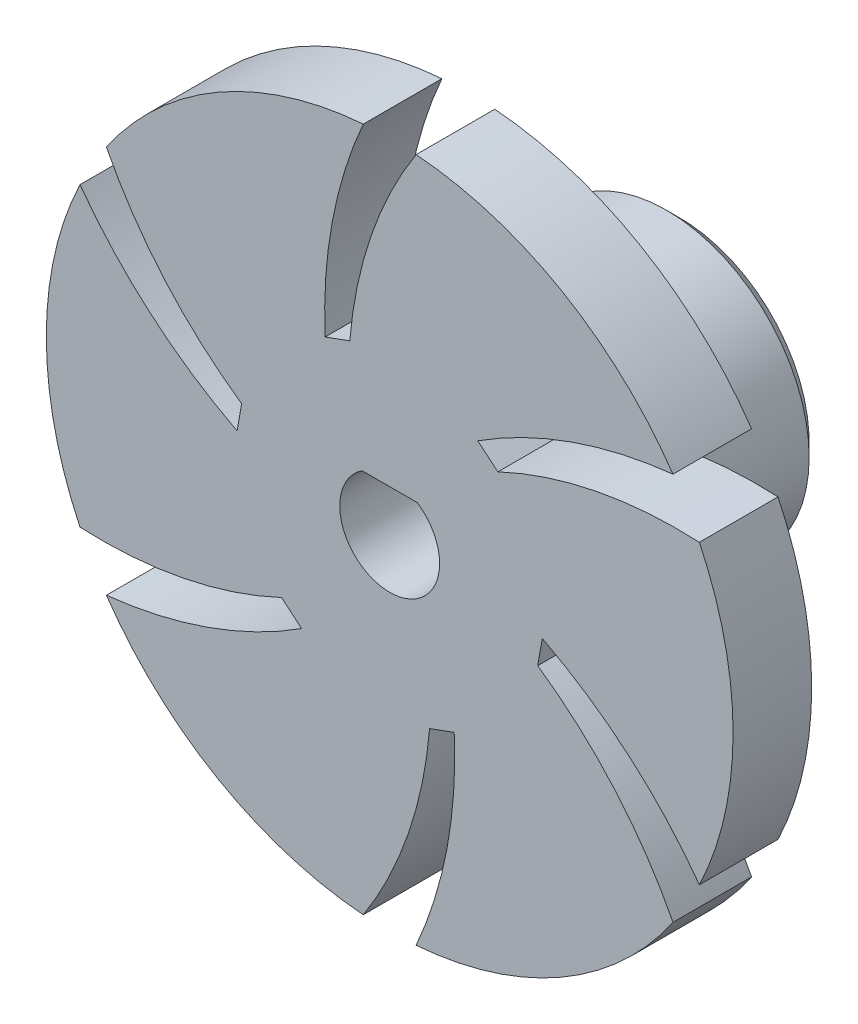
ISO-10303-21;
HEADER;
FILE_DESCRIPTION(('STEP AP214'),'2;1');
FILE_NAME('part.step','',(''),(''),'','','');
FILE_SCHEMA(('AUTOMOTIVE_DESIGN { 1 0 10303 214 1 1 1 1 }'));
ENDSEC;
DATA;
#1=APPLICATION_CONTEXT('core data for automotive mechanical design processes');
#2=APPLICATION_PROTOCOL_DEFINITION('international standard','automotive_design',2000,#1);
#3=PRODUCT_CONTEXT('',#1,'mechanical');
#4=PRODUCT('Part','Part','',(#3));
#5=PRODUCT_RELATED_PRODUCT_CATEGORY('part','',(#4));
#6=PRODUCT_DEFINITION_FORMATION('','',#4);
#7=PRODUCT_DEFINITION_CONTEXT('part definition',#1,'design');
#8=PRODUCT_DEFINITION('design','',#6,#7);
#9=PRODUCT_DEFINITION_SHAPE('','',#8);
#10=(LENGTH_UNIT() NAMED_UNIT(*) SI_UNIT(.MILLI.,.METRE.));
#11=(NAMED_UNIT(*) PLANE_ANGLE_UNIT() SI_UNIT($,.RADIAN.));
#12=(NAMED_UNIT(*) SI_UNIT($,.STERADIAN.) SOLID_ANGLE_UNIT());
#13=UNCERTAINTY_MEASURE_WITH_UNIT(LENGTH_MEASURE(1.E-05),#10,'distance_accuracy_value','');
#14=(GEOMETRIC_REPRESENTATION_CONTEXT(3) GLOBAL_UNCERTAINTY_ASSIGNED_CONTEXT((#13)) GLOBAL_UNIT_ASSIGNED_CONTEXT((#10,
#11,#12)) REPRESENTATION_CONTEXT('',''));
#15=CARTESIAN_POINT('',(0.,0.,0.));
#16=DIRECTION('',(0.,0.,1.));
#17=DIRECTION('',(1.,0.,0.));
#18=AXIS2_PLACEMENT_3D('',#15,#16,#17);
#19=CARTESIAN_POINT('',(0.,0.,2.3622));
#20=DIRECTION('',(0.,0.,-1.));
#21=DIRECTION('',(-1.,0.,0.));
#22=AXIS2_PLACEMENT_3D('',#19,#20,#21);
#23=CYLINDRICAL_SURFACE('',#22,20.6375);
#24=CARTESIAN_POINT('',(0.,0.,2.3622));
#25=DIRECTION('',(0.,0.,1.));
#26=DIRECTION('',(1.,0.,0.));
#27=AXIS2_PLACEMENT_3D('',#24,#25,#26);
#28=CIRCLE('',#27,20.6375);
#29=CARTESIAN_POINT('',(-17.0258933045108,-11.6629911872304,2.3622));
#30=VERTEX_POINT('',#29);
#31=CARTESIAN_POINT('',(-1.5875,-20.576351717445,2.3622));
#32=VERTEX_POINT('',#31);
#33=EDGE_CURVE('E487',#30,#32,#28,.T.);
#34=ORIENTED_EDGE('',*,*,#33,.F.);
#35=DIRECTION('',(0.,0.,1.));
#36=VECTOR('',#35,1.);
#37=CARTESIAN_POINT('',(-17.0258933045108,-11.6629911872304,-2.3622));
#38=LINE('',#37,#36);
#39=CARTESIAN_POINT('',(-17.0258933045108,-11.6629911872304,-2.3622));
#40=VERTEX_POINT('',#39);
#41=EDGE_CURVE('E250',#40,#30,#38,.T.);
#42=ORIENTED_EDGE('',*,*,#41,.F.);
#43=CARTESIAN_POINT('',(0.,0.,-2.3622));
#44=DIRECTION('',(0.,0.,1.));
#45=DIRECTION('',(1.,0.,0.));
#46=AXIS2_PLACEMENT_3D('',#43,#44,#45);
#47=CIRCLE('',#46,20.6375);
#48=CARTESIAN_POINT('',(-1.5875,-20.576351717445,-2.3622));
#49=VERTEX_POINT('',#48);
#50=EDGE_CURVE('E470',#40,#49,#47,.T.);
#51=ORIENTED_EDGE('',*,*,#50,.T.);
#52=DIRECTION('',(0.,0.,1.));
#53=VECTOR('',#52,1.);
#54=CARTESIAN_POINT('',(-1.5875,-20.576351717445,-2.3622));
#55=LINE('',#54,#53);
#56=EDGE_CURVE('E266',#49,#32,#55,.T.);
#57=ORIENTED_EDGE('',*,*,#56,.T.);
#58=EDGE_LOOP('',(#34,#42,#51,#57));
#59=FACE_BOUND('',#58,.T.);
#60=ADVANCED_FACE('F35',(#59),#23,.T.);
#61=CARTESIAN_POINT('',(1.5875,-20.576351717445,2.3622));
#62=VERTEX_POINT('',#61);
#63=CARTESIAN_POINT('',(17.025893304511,-11.6629911872301,2.3622));
#64=VERTEX_POINT('',#63);
#65=EDGE_CURVE('E488',#62,#64,#28,.T.);
#66=ORIENTED_EDGE('',*,*,#65,.F.);
#67=DIRECTION('',(0.,0.,1.));
#68=VECTOR('',#67,1.);
#69=CARTESIAN_POINT('',(1.5875,-20.576351717445,-2.3622));
#70=LINE('',#69,#68);
#71=CARTESIAN_POINT('',(1.5875,-20.576351717445,-2.3622));
#72=VERTEX_POINT('',#71);
#73=EDGE_CURVE('E228',#72,#62,#70,.T.);
#74=ORIENTED_EDGE('',*,*,#73,.F.);
#75=CARTESIAN_POINT('',(17.025893304511,-11.6629911872301,-2.3622));
#76=VERTEX_POINT('',#75);
#77=EDGE_CURVE('E465',#72,#76,#47,.T.);
#78=ORIENTED_EDGE('',*,*,#77,.T.);
#79=DIRECTION('',(0.,0.,1.));
#80=VECTOR('',#79,1.);
#81=CARTESIAN_POINT('',(17.025893304511,-11.6629911872301,-2.3622));
#82=LINE('',#81,#80);
#83=EDGE_CURVE('E292',#76,#64,#82,.T.);
#84=ORIENTED_EDGE('',*,*,#83,.T.);
#85=EDGE_LOOP('',(#66,#74,#78,#84));
#86=FACE_BOUND('',#85,.T.);
#87=ADVANCED_FACE('F405',(#86),#23,.T.);
#88=CARTESIAN_POINT('',(18.613393304511,-8.91336053021451,2.3622));
#89=VERTEX_POINT('',#88);
#90=CARTESIAN_POINT('',(18.6133933045108,8.9133605302149,2.3622));
#91=VERTEX_POINT('',#90);
#92=EDGE_CURVE('E491',#89,#91,#28,.T.);
#93=ORIENTED_EDGE('',*,*,#92,.F.);
#94=DIRECTION('',(0.,0.,1.));
#95=VECTOR('',#94,1.);
#96=CARTESIAN_POINT('',(18.613393304511,-8.91336053021451,-2.3622));
#97=LINE('',#96,#95);
#98=CARTESIAN_POINT('',(18.613393304511,-8.91336053021451,-2.3622));
#99=VERTEX_POINT('',#98);
#100=EDGE_CURVE('E256',#99,#89,#97,.T.);
#101=ORIENTED_EDGE('',*,*,#100,.F.);
#102=CARTESIAN_POINT('',(18.6133933045108,8.9133605302149,-2.3622));
#103=VERTEX_POINT('',#102);
#104=EDGE_CURVE('E463',#99,#103,#47,.T.);
#105=ORIENTED_EDGE('',*,*,#104,.T.);
#106=DIRECTION('',(0.,0.,1.));
#107=VECTOR('',#106,1.);
#108=CARTESIAN_POINT('',(18.6133933045108,8.9133605302149,-2.3622));
#109=LINE('',#108,#107);
#110=EDGE_CURVE('E316',#103,#91,#109,.T.);
#111=ORIENTED_EDGE('',*,*,#110,.T.);
#112=EDGE_LOOP('',(#93,#101,#105,#111));
#113=FACE_BOUND('',#112,.T.);
#114=ADVANCED_FACE('F411',(#113),#23,.T.);
#115=CARTESIAN_POINT('',(17.0258933045108,11.6629911872305,2.3622));
#116=VERTEX_POINT('',#115);
#117=CARTESIAN_POINT('',(1.5875,20.576351717445,2.3622));
#118=VERTEX_POINT('',#117);
#119=EDGE_CURVE('E387',#116,#118,#28,.T.);
#120=ORIENTED_EDGE('',*,*,#119,.F.);
#121=DIRECTION('',(0.,0.,1.));
#122=VECTOR('',#121,1.);
#123=CARTESIAN_POINT('',(17.0258933045108,11.6629911872305,-2.3622));
#124=LINE('',#123,#122);
#125=CARTESIAN_POINT('',(17.0258933045108,11.6629911872305,-2.3622));
#126=VERTEX_POINT('',#125);
#127=EDGE_CURVE('E282',#126,#116,#124,.T.);
#128=ORIENTED_EDGE('',*,*,#127,.F.);
#129=CARTESIAN_POINT('',(1.5875,20.576351717445,-2.3622));
#130=VERTEX_POINT('',#129);
#131=EDGE_CURVE('E375',#126,#130,#47,.T.);
#132=ORIENTED_EDGE('',*,*,#131,.T.);
#133=DIRECTION('',(0.,0.,1.));
#134=VECTOR('',#133,1.);
#135=CARTESIAN_POINT('',(1.5875,20.576351717445,-2.3622));
#136=LINE('',#135,#134);
#137=EDGE_CURVE('E376',#130,#118,#136,.T.);
#138=ORIENTED_EDGE('',*,*,#137,.T.);
#139=EDGE_LOOP('',(#120,#128,#132,#138));
#140=FACE_BOUND('',#139,.T.);
#141=ADVANCED_FACE('F426',(#140),#23,.T.);
#142=CARTESIAN_POINT('',(-18.6133933045109,8.91336053021464,-2.3622));
#143=VERTEX_POINT('',#142);
#144=CARTESIAN_POINT('',(-18.6133933045109,-8.91336053021477,-2.3622));
#145=VERTEX_POINT('',#144);
#146=EDGE_CURVE('E391',#143,#145,#47,.T.);
#147=ORIENTED_EDGE('',*,*,#146,.T.);
#148=DIRECTION('',(0.,0.,1.));
#149=VECTOR('',#148,1.);
#150=CARTESIAN_POINT('',(-18.6133933045109,-8.91336053021477,-2.3622));
#151=LINE('',#150,#149);
#152=CARTESIAN_POINT('',(-18.6133933045109,-8.91336053021477,2.3622));
#153=VERTEX_POINT('',#152);
#154=EDGE_CURVE('E238',#145,#153,#151,.T.);
#155=ORIENTED_EDGE('',*,*,#154,.T.);
#156=CARTESIAN_POINT('',(-18.6133933045109,8.91336053021464,2.3622));
#157=VERTEX_POINT('',#156);
#158=EDGE_CURVE('E386',#157,#153,#28,.T.);
#159=ORIENTED_EDGE('',*,*,#158,.F.);
#160=DIRECTION('',(0.,0.,1.));
#161=VECTOR('',#160,1.);
#162=CARTESIAN_POINT('',(-18.6133933045109,8.91336053021464,-2.3622));
#163=LINE('',#162,#161);
#164=EDGE_CURVE('E352',#143,#157,#163,.T.);
#165=ORIENTED_EDGE('',*,*,#164,.F.);
#166=EDGE_LOOP('',(#147,#155,#159,#165));
#167=FACE_BOUND('',#166,.T.);
#168=ADVANCED_FACE('F417',(#167),#23,.T.);
#169=CARTESIAN_POINT('',(-1.5875,20.576351717445,-2.3622));
#170=VERTEX_POINT('',#169);
#171=CARTESIAN_POINT('',(-17.0258933045109,11.6629911872302,-2.3622));
#172=VERTEX_POINT('',#171);
#173=EDGE_CURVE('E388',#170,#172,#47,.T.);
#174=ORIENTED_EDGE('',*,*,#173,.T.);
#175=DIRECTION('',(0.,0.,1.));
#176=VECTOR('',#175,1.);
#177=CARTESIAN_POINT('',(-17.0258933045109,11.6629911872302,-2.3622));
#178=LINE('',#177,#176);
#179=CARTESIAN_POINT('',(-17.0258933045109,11.6629911872302,2.3622));
#180=VERTEX_POINT('',#179);
#181=EDGE_CURVE('E340',#172,#180,#178,.T.);
#182=ORIENTED_EDGE('',*,*,#181,.T.);
#183=CARTESIAN_POINT('',(-1.5875,20.576351717445,2.3622));
#184=VERTEX_POINT('',#183);
#185=EDGE_CURVE('E382',#184,#180,#28,.T.);
#186=ORIENTED_EDGE('',*,*,#185,.F.);
#187=DIRECTION('',(0.,0.,1.));
#188=VECTOR('',#187,1.);
#189=CARTESIAN_POINT('',(-1.5875,20.576351717445,-2.3622));
#190=LINE('',#189,#188);
#191=EDGE_CURVE('E373',#170,#184,#190,.T.);
#192=ORIENTED_EDGE('',*,*,#191,.F.);
#193=EDGE_LOOP('',(#174,#182,#186,#192));
#194=FACE_BOUND('',#193,.T.);
#195=ADVANCED_FACE('F407',(#194),#23,.T.);
#196=CARTESIAN_POINT('',(0.,0.,2.3622));
#197=DIRECTION('',(0.,0.,1.));
#198=DIRECTION('',(1.,0.,0.));
#199=AXIS2_PLACEMENT_3D('',#196,#197,#198);
#200=PLANE('',#199);
#201=CARTESIAN_POINT('',(0.,0.,2.3622));
#202=DIRECTION('',(0.,0.,1.));
#203=DIRECTION('',(1.,0.,0.));
#204=AXIS2_PLACEMENT_3D('',#201,#202,#203);
#205=CIRCLE('',#204,3.);
#206=CARTESIAN_POINT('',(-1.6583123951777,2.5,2.3622));
#207=VERTEX_POINT('',#206);
#208=CARTESIAN_POINT('',(1.6583123951777,2.5,2.3622));
#209=VERTEX_POINT('',#208);
#210=EDGE_CURVE('E50',#207,#209,#205,.T.);
#211=ORIENTED_EDGE('',*,*,#210,.F.);
#212=DIRECTION('',(-1.,0.,0.));
#213=VECTOR('',#212,1.);
#214=CARTESIAN_POINT('',(-1.6583123951777,2.5,2.3622));
#215=LINE('',#214,#213);
#216=EDGE_CURVE('E218',#209,#207,#215,.T.);
#217=ORIENTED_EDGE('',*,*,#216,.F.);
#218=EDGE_LOOP('',(#211,#217));
#219=FACE_BOUND('',#218,.T.);
#220=CARTESIAN_POINT('',(-19.8740246137676,15.1610275848558,2.3622));
#221=DIRECTION('',(0.,0.,1.));
#222=DIRECTION('',(0.500000000000004,-0.866025403784436,0.));
#223=AXIS2_PLACEMENT_3D('',#220,#221,#222);
#224=CIRCLE('',#223,26.9748);
#225=CARTESIAN_POINT('',(-5.29371814833035,-7.53378456272383,2.3622));
#226=VERTEX_POINT('',#225);
#227=EDGE_CURVE('E244',#30,#226,#224,.T.);
#228=ORIENTED_EDGE('',*,*,#227,.F.);
#229=ORIENTED_EDGE('',*,*,#33,.T.);
#230=CARTESIAN_POINT('',(-22.9145090436111,-6.78074787949241,2.3622));
#231=DIRECTION('',(0.,0.,-1.));
#232=DIRECTION('',(1.,0.,0.));
#233=AXIS2_PLACEMENT_3D('',#230,#231,#232);
#234=CIRCLE('',#233,25.4);
#235=CARTESIAN_POINT('',(2.39776180457901,-8.89,2.3622));
#236=VERTEX_POINT('',#235);
#237=EDGE_CURVE('E264',#236,#32,#234,.T.);
#238=ORIENTED_EDGE('',*,*,#237,.F.);
#239=DIRECTION('',(-0.939692620785908,-0.342020143325669,0.));
#240=VECTOR('',#239,1.);
#241=CARTESIAN_POINT('',(2.39776180457901,-8.89,2.3622));
#242=LINE('',#241,#240);
#243=CARTESIAN_POINT('',(3.87758974379266,-8.35138667829074,2.3622));
#244=VERTEX_POINT('',#243);
#245=EDGE_CURVE('E253',#244,#236,#242,.T.);
#246=ORIENTED_EDGE('',*,*,#245,.F.);
#247=CARTESIAN_POINT('',(-23.0668473428456,-9.63089639853194,2.3622));
#248=DIRECTION('',(0.,0.,1.));
#249=DIRECTION('',(1.,0.,0.));
#250=AXIS2_PLACEMENT_3D('',#247,#248,#249);
#251=CIRCLE('',#250,26.9748);
#252=EDGE_CURVE('E272',#62,#244,#251,.T.);
#253=ORIENTED_EDGE('',*,*,#252,.F.);
#254=ORIENTED_EDGE('',*,*,#65,.T.);
#255=CARTESIAN_POINT('',(-5.58495460150743,-23.2349208867617,2.3622));
#256=DIRECTION('',(0.,0.,-1.));
#257=DIRECTION('',(0.499999999999992,0.866025403784443,0.));
#258=AXIS2_PLACEMENT_3D('',#255,#256,#257);
#259=CIRCLE('',#258,25.4);
#260=CARTESIAN_POINT('',(8.89784674193319,-2.36847736501047,2.3622));
#261=VERTEX_POINT('',#260);
#262=EDGE_CURVE('E290',#261,#64,#259,.T.);
#263=ORIENTED_EDGE('',*,*,#262,.F.);
#264=DIRECTION('',(-0.173648177666921,-0.98480775301221,0.));
#265=VECTOR('',#264,1.);
#266=CARTESIAN_POINT('',(8.89784674193319,-2.36847736501047,2.3622));
#267=LINE('',#266,#265);
#268=CARTESIAN_POINT('',(9.17130789212305,-0.817602115566844,2.3622));
#269=VERTEX_POINT('',#268);
#270=EDGE_CURVE('E279',#269,#261,#267,.T.);
#271=ORIENTED_EDGE('',*,*,#270,.F.);
#272=CARTESIAN_POINT('',(-3.19282272907786,-24.7919239833879,2.3622));
#273=DIRECTION('',(0.,0.,1.));
#274=DIRECTION('',(0.499999999999992,0.866025403784443,0.));
#275=AXIS2_PLACEMENT_3D('',#272,#273,#274);
#276=CIRCLE('',#275,26.9748);
#277=EDGE_CURVE('E298',#89,#269,#276,.T.);
#278=ORIENTED_EDGE('',*,*,#277,.F.);
#279=ORIENTED_EDGE('',*,*,#92,.T.);
#280=CARTESIAN_POINT('',(17.3295544421036,-16.454173007269,2.3622));
#281=DIRECTION('',(0.,0.,-1.));
#282=DIRECTION('',(-0.50000000000001,0.866025403784433,0.));
#283=AXIS2_PLACEMENT_3D('',#280,#281,#282);
#284=CIRCLE('',#283,25.4);
#285=CARTESIAN_POINT('',(6.50008493735408,6.52152263498952,2.3622));
#286=VERTEX_POINT('',#285);
#287=EDGE_CURVE('E314',#286,#91,#284,.T.);
#288=ORIENTED_EDGE('',*,*,#287,.F.);
#289=DIRECTION('',(0.766044443118986,-0.64278760968653,0.));
#290=VECTOR('',#289,1.);
#291=CARTESIAN_POINT('',(6.50008493735408,6.52152263498952,2.3622));
#292=LINE('',#291,#290);
#293=CARTESIAN_POINT('',(5.2937181483303,7.53378456272387,2.3622));
#294=VERTEX_POINT('',#293);
#295=EDGE_CURVE('E223',#294,#286,#292,.T.);
#296=ORIENTED_EDGE('',*,*,#295,.F.);
#297=CARTESIAN_POINT('',(19.8740246137677,-15.1610275848557,2.3622));
#298=DIRECTION('',(0.,0.,1.));
#299=DIRECTION('',(-0.50000000000001,0.866025403784433,0.));
#300=AXIS2_PLACEMENT_3D('',#297,#298,#299);
#301=CIRCLE('',#300,26.9748);
#302=EDGE_CURVE('E322',#116,#294,#301,.T.);
#303=ORIENTED_EDGE('',*,*,#302,.F.);
#304=ORIENTED_EDGE('',*,*,#119,.T.);
#305=CARTESIAN_POINT('',(22.9145090436111,6.78074787949241,2.3622));
#306=DIRECTION('',(0.,0.,-1.));
#307=DIRECTION('',(-1.,0.,0.));
#308=AXIS2_PLACEMENT_3D('',#305,#306,#307);
#309=CIRCLE('',#308,25.4);
#310=CARTESIAN_POINT('',(-2.39776180457901,8.89,2.3622));
#311=VERTEX_POINT('',#310);
#312=EDGE_CURVE('E359',#311,#118,#309,.T.);
#313=ORIENTED_EDGE('',*,*,#312,.F.);
#314=DIRECTION('',(0.939692620785908,0.342020143325669,0.));
#315=VECTOR('',#314,1.);
#316=CARTESIAN_POINT('',(-2.39776180457901,8.89,2.3622));
#317=LINE('',#316,#315);
#318=CARTESIAN_POINT('',(-3.87758974379266,8.35138667829074,2.3622));
#319=VERTEX_POINT('',#318);
#320=EDGE_CURVE('E368',#319,#311,#317,.T.);
#321=ORIENTED_EDGE('',*,*,#320,.F.);
#322=CARTESIAN_POINT('',(23.0668473428456,9.63089639853194,2.3622));
#323=DIRECTION('',(0.,0.,1.));
#324=DIRECTION('',(-1.,0.,0.));
#325=AXIS2_PLACEMENT_3D('',#322,#323,#324);
#326=CIRCLE('',#325,26.9748);
#327=EDGE_CURVE('E354',#184,#319,#326,.T.);
#328=ORIENTED_EDGE('',*,*,#327,.F.);
#329=ORIENTED_EDGE('',*,*,#185,.T.);
#330=CARTESIAN_POINT('',(5.5849546015076,23.2349208867617,2.3622));
#331=DIRECTION('',(0.,0.,-1.));
#332=DIRECTION('',(-0.499999999999998,-0.86602540378444,0.));
#333=AXIS2_PLACEMENT_3D('',#330,#331,#332);
#334=CIRCLE('',#333,25.4);
#335=CARTESIAN_POINT('',(-8.89784674193317,2.36847736501054,2.3622));
#336=VERTEX_POINT('',#335);
#337=EDGE_CURVE('E338',#336,#180,#334,.T.);
#338=ORIENTED_EDGE('',*,*,#337,.F.);
#339=DIRECTION('',(0.173648177666928,0.984807753012209,0.));
#340=VECTOR('',#339,1.);
#341=CARTESIAN_POINT('',(-8.89784674193317,2.36847736501053,2.3622));
#342=LINE('',#341,#340);
#343=CARTESIAN_POINT('',(-9.17130789212305,0.817602115566909,2.3622));
#344=VERTEX_POINT('',#343);
#345=EDGE_CURVE('E252',#344,#336,#342,.T.);
#346=ORIENTED_EDGE('',*,*,#345,.F.);
#347=CARTESIAN_POINT('',(3.19282272907804,24.7919239833879,2.3622));
#348=DIRECTION('',(0.,0.,1.));
#349=DIRECTION('',(-0.499999999999998,-0.86602540378444,0.));
#350=AXIS2_PLACEMENT_3D('',#347,#348,#349);
#351=CIRCLE('',#350,26.9748);
#352=EDGE_CURVE('E346',#157,#344,#351,.T.);
#353=ORIENTED_EDGE('',*,*,#352,.F.);
#354=ORIENTED_EDGE('',*,*,#158,.T.);
#355=CARTESIAN_POINT('',(-17.3295544421035,16.4541730072692,2.3622));
#356=DIRECTION('',(0.,0.,-1.));
#357=DIRECTION('',(0.500000000000004,-0.866025403784436,0.));
#358=AXIS2_PLACEMENT_3D('',#355,#356,#357);
#359=CIRCLE('',#358,25.4);
#360=CARTESIAN_POINT('',(-6.50008493735412,-6.52152263498947,2.3622));
#361=VERTEX_POINT('',#360);
#362=EDGE_CURVE('E236',#361,#153,#359,.T.);
#363=ORIENTED_EDGE('',*,*,#362,.F.);
#364=DIRECTION('',(-0.766044443118981,0.642787609686536,0.));
#365=VECTOR('',#364,1.);
#366=CARTESIAN_POINT('',(-6.50008493735412,-6.52152263498948,2.3622));
#367=LINE('',#366,#365);
#368=EDGE_CURVE('E225',#226,#361,#367,.T.);
#369=ORIENTED_EDGE('',*,*,#368,.F.);
#370=EDGE_LOOP('',(#228,#229,#238,#246,#253,#254,#263,#271,#278,#279,#288,#296,#303,#304,#313,
#321,#328,#329,#338,#346,#353,#354,#363,#369));
#371=FACE_BOUND('',#370,.T.);
#372=ADVANCED_FACE('F416',(#219,#371),#200,.T.);
#373=CARTESIAN_POINT('',(0.,0.,-2.3622));
#374=DIRECTION('',(0.,0.,1.));
#375=DIRECTION('',(1.,0.,0.));
#376=AXIS2_PLACEMENT_3D('',#373,#374,#375);
#377=PLANE('',#376);
#378=ORIENTED_EDGE('',*,*,#50,.F.);
#379=CARTESIAN_POINT('',(-19.8740246137676,15.1610275848558,-2.3622));
#380=DIRECTION('',(0.,0.,1.));
#381=DIRECTION('',(0.500000000000004,-0.866025403784436,0.));
#382=AXIS2_PLACEMENT_3D('',#379,#380,#381);
#383=CIRCLE('',#382,26.9748);
#384=CARTESIAN_POINT('',(-5.29371814833035,-7.53378456272383,-2.3622));
#385=VERTEX_POINT('',#384);
#386=EDGE_CURVE('E247',#40,#385,#383,.T.);
#387=ORIENTED_EDGE('',*,*,#386,.T.);
#388=DIRECTION('',(-0.766044443118981,0.642787609686536,0.));
#389=VECTOR('',#388,1.);
#390=CARTESIAN_POINT('',(-6.50008493735412,-6.52152263498948,-2.3622));
#391=LINE('',#390,#389);
#392=CARTESIAN_POINT('',(-6.50008493735412,-6.52152263498947,-2.3622));
#393=VERTEX_POINT('',#392);
#394=EDGE_CURVE('E231',#385,#393,#391,.T.);
#395=ORIENTED_EDGE('',*,*,#394,.T.);
#396=CARTESIAN_POINT('',(-17.3295544421035,16.4541730072692,-2.3622));
#397=DIRECTION('',(0.,0.,-1.));
#398=DIRECTION('',(0.500000000000004,-0.866025403784436,0.));
#399=AXIS2_PLACEMENT_3D('',#396,#397,#398);
#400=CIRCLE('',#399,25.4);
#401=EDGE_CURVE('E241',#393,#145,#400,.T.);
#402=ORIENTED_EDGE('',*,*,#401,.T.);
#403=ORIENTED_EDGE('',*,*,#146,.F.);
#404=CARTESIAN_POINT('',(3.19282272907804,24.7919239833879,-2.3622));
#405=DIRECTION('',(0.,0.,1.));
#406=DIRECTION('',(-0.499999999999998,-0.86602540378444,0.));
#407=AXIS2_PLACEMENT_3D('',#404,#405,#406);
#408=CIRCLE('',#407,26.9748);
#409=CARTESIAN_POINT('',(-9.17130789212305,0.817602115566909,-2.3622));
#410=VERTEX_POINT('',#409);
#411=EDGE_CURVE('E349',#143,#410,#408,.T.);
#412=ORIENTED_EDGE('',*,*,#411,.T.);
#413=DIRECTION('',(0.173648177666928,0.984807753012209,0.));
#414=VECTOR('',#413,1.);
#415=CARTESIAN_POINT('',(-8.89784674193317,2.36847736501053,-2.3622));
#416=LINE('',#415,#414);
#417=CARTESIAN_POINT('',(-8.89784674193317,2.36847736501054,-2.3622));
#418=VERTEX_POINT('',#417);
#419=EDGE_CURVE('E333',#410,#418,#416,.T.);
#420=ORIENTED_EDGE('',*,*,#419,.T.);
#421=CARTESIAN_POINT('',(5.5849546015076,23.2349208867617,-2.3622));
#422=DIRECTION('',(0.,0.,-1.));
#423=DIRECTION('',(-0.499999999999998,-0.86602540378444,0.));
#424=AXIS2_PLACEMENT_3D('',#421,#422,#423);
#425=CIRCLE('',#424,25.4);
#426=EDGE_CURVE('E343',#418,#172,#425,.T.);
#427=ORIENTED_EDGE('',*,*,#426,.T.);
#428=ORIENTED_EDGE('',*,*,#173,.F.);
#429=CARTESIAN_POINT('',(23.0668473428456,9.63089639853194,-2.3622));
#430=DIRECTION('',(0.,0.,1.));
#431=DIRECTION('',(-1.,0.,0.));
#432=AXIS2_PLACEMENT_3D('',#429,#430,#431);
#433=CIRCLE('',#432,26.9748);
#434=CARTESIAN_POINT('',(-3.87758974379266,8.35138667829074,-2.3622));
#435=VERTEX_POINT('',#434);
#436=EDGE_CURVE('E355',#170,#435,#433,.T.);
#437=ORIENTED_EDGE('',*,*,#436,.T.);
#438=DIRECTION('',(0.939692620785908,0.342020143325669,0.));
#439=VECTOR('',#438,1.);
#440=CARTESIAN_POINT('',(-2.39776180457901,8.89,-2.3622));
#441=LINE('',#440,#439);
#442=CARTESIAN_POINT('',(-2.39776180457901,8.89,-2.3622));
#443=VERTEX_POINT('',#442);
#444=EDGE_CURVE('E358',#435,#443,#441,.T.);
#445=ORIENTED_EDGE('',*,*,#444,.T.);
#446=CARTESIAN_POINT('',(22.9145090436111,6.78074787949241,-2.3622));
#447=DIRECTION('',(0.,0.,-1.));
#448=DIRECTION('',(-1.,0.,0.));
#449=AXIS2_PLACEMENT_3D('',#446,#447,#448);
#450=CIRCLE('',#449,25.4);
#451=EDGE_CURVE('E362',#443,#130,#450,.T.);
#452=ORIENTED_EDGE('',*,*,#451,.T.);
#453=ORIENTED_EDGE('',*,*,#131,.F.);
#454=CARTESIAN_POINT('',(19.8740246137677,-15.1610275848557,-2.3622));
#455=DIRECTION('',(0.,0.,1.));
#456=DIRECTION('',(-0.50000000000001,0.866025403784433,0.));
#457=AXIS2_PLACEMENT_3D('',#454,#455,#456);
#458=CIRCLE('',#457,26.9748);
#459=CARTESIAN_POINT('',(5.2937181483303,7.53378456272387,-2.3622));
#460=VERTEX_POINT('',#459);
#461=EDGE_CURVE('E325',#126,#460,#458,.T.);
#462=ORIENTED_EDGE('',*,*,#461,.T.);
#463=DIRECTION('',(0.766044443118986,-0.64278760968653,0.));
#464=VECTOR('',#463,1.);
#465=CARTESIAN_POINT('',(6.50008493735408,6.52152263498952,-2.3622));
#466=LINE('',#465,#464);
#467=CARTESIAN_POINT('',(6.50008493735408,6.52152263498952,-2.3622));
#468=VERTEX_POINT('',#467);
#469=EDGE_CURVE('E309',#460,#468,#466,.T.);
#470=ORIENTED_EDGE('',*,*,#469,.T.);
#471=CARTESIAN_POINT('',(17.3295544421036,-16.454173007269,-2.3622));
#472=DIRECTION('',(0.,0.,-1.));
#473=DIRECTION('',(-0.50000000000001,0.866025403784433,0.));
#474=AXIS2_PLACEMENT_3D('',#471,#472,#473);
#475=CIRCLE('',#474,25.4);
#476=EDGE_CURVE('E319',#468,#103,#475,.T.);
#477=ORIENTED_EDGE('',*,*,#476,.T.);
#478=ORIENTED_EDGE('',*,*,#104,.F.);
#479=CARTESIAN_POINT('',(-3.19282272907786,-24.7919239833879,-2.3622));
#480=DIRECTION('',(0.,0.,1.));
#481=DIRECTION('',(0.499999999999992,0.866025403784443,0.));
#482=AXIS2_PLACEMENT_3D('',#479,#480,#481);
#483=CIRCLE('',#482,26.9748);
#484=CARTESIAN_POINT('',(9.17130789212305,-0.817602115566844,-2.3622));
#485=VERTEX_POINT('',#484);
#486=EDGE_CURVE('E301',#99,#485,#483,.T.);
#487=ORIENTED_EDGE('',*,*,#486,.T.);
#488=DIRECTION('',(-0.173648177666921,-0.98480775301221,0.));
#489=VECTOR('',#488,1.);
#490=CARTESIAN_POINT('',(8.89784674193319,-2.36847736501047,-2.3622));
#491=LINE('',#490,#489);
#492=CARTESIAN_POINT('',(8.89784674193319,-2.36847736501047,-2.3622));
#493=VERTEX_POINT('',#492);
#494=EDGE_CURVE('E285',#485,#493,#491,.T.);
#495=ORIENTED_EDGE('',*,*,#494,.T.);
#496=CARTESIAN_POINT('',(-5.58495460150743,-23.2349208867617,-2.3622));
#497=DIRECTION('',(0.,0.,-1.));
#498=DIRECTION('',(0.499999999999992,0.866025403784443,0.));
#499=AXIS2_PLACEMENT_3D('',#496,#497,#498);
#500=CIRCLE('',#499,25.4);
#501=EDGE_CURVE('E295',#493,#76,#500,.T.);
#502=ORIENTED_EDGE('',*,*,#501,.T.);
#503=ORIENTED_EDGE('',*,*,#77,.F.);
#504=CARTESIAN_POINT('',(-23.0668473428456,-9.63089639853194,-2.3622));
#505=DIRECTION('',(0.,0.,1.));
#506=DIRECTION('',(1.,0.,0.));
#507=AXIS2_PLACEMENT_3D('',#504,#505,#506);
#508=CIRCLE('',#507,26.9748);
#509=CARTESIAN_POINT('',(3.87758974379266,-8.35138667829074,-2.3622));
#510=VERTEX_POINT('',#509);
#511=EDGE_CURVE('E275',#72,#510,#508,.T.);
#512=ORIENTED_EDGE('',*,*,#511,.T.);
#513=DIRECTION('',(-0.939692620785908,-0.342020143325669,0.));
#514=VECTOR('',#513,1.);
#515=CARTESIAN_POINT('',(2.39776180457901,-8.89,-2.3622));
#516=LINE('',#515,#514);
#517=CARTESIAN_POINT('',(2.39776180457901,-8.89,-2.3622));
#518=VERTEX_POINT('',#517);
#519=EDGE_CURVE('E259',#510,#518,#516,.T.);
#520=ORIENTED_EDGE('',*,*,#519,.T.);
#521=CARTESIAN_POINT('',(-22.9145090436111,-6.78074787949241,-2.3622));
#522=DIRECTION('',(0.,0.,-1.));
#523=DIRECTION('',(1.,0.,0.));
#524=AXIS2_PLACEMENT_3D('',#521,#522,#523);
#525=CIRCLE('',#524,25.4);
#526=EDGE_CURVE('E269',#518,#49,#525,.T.);
#527=ORIENTED_EDGE('',*,*,#526,.T.);
#528=EDGE_LOOP('',(#378,#387,#395,#402,#403,#412,#420,#427,#428,#437,#445,#452,#453,#462,#470,
#477,#478,#487,#495,#502,#503,#512,#520,#527));
#529=FACE_BOUND('',#528,.T.);
#530=CARTESIAN_POINT('',(0.,0.,-2.3622));
#531=DIRECTION('',(0.,0.,1.));
#532=DIRECTION('',(1.,0.,0.));
#533=AXIS2_PLACEMENT_3D('',#530,#531,#532);
#534=CIRCLE('',#533,8.5725);
#535=CARTESIAN_POINT('',(8.5725,0.,-2.3622));
#536=VERTEX_POINT('',#535);
#537=EDGE_CURVE('E385',#536,#536,#534,.F.);
#538=ORIENTED_EDGE('',*,*,#537,.F.);
#539=EDGE_LOOP('',(#538));
#540=FACE_BOUND('',#539,.T.);
#541=ADVANCED_FACE('F423',(#529,#540),#377,.F.);
#542=CARTESIAN_POINT('',(23.0668473428456,9.63089639853194,-2.3622));
#543=DIRECTION('',(0.,0.,1.));
#544=DIRECTION('',(1.,0.,0.));
#545=AXIS2_PLACEMENT_3D('',#542,#543,#544);
#546=CYLINDRICAL_SURFACE('',#545,26.9748);
#547=ORIENTED_EDGE('',*,*,#327,.T.);
#548=DIRECTION('',(0.,0.,1.));
#549=VECTOR('',#548,1.);
#550=CARTESIAN_POINT('',(-3.87758974379266,8.35138667829074,-2.3622));
#551=LINE('',#550,#549);
#552=EDGE_CURVE('E365',#435,#319,#551,.T.);
#553=ORIENTED_EDGE('',*,*,#552,.F.);
#554=ORIENTED_EDGE('',*,*,#436,.F.);
#555=ORIENTED_EDGE('',*,*,#191,.T.);
#556=EDGE_LOOP('',(#547,#553,#554,#555));
#557=FACE_BOUND('',#556,.T.);
#558=ADVANCED_FACE('F451',(#557),#546,.F.);
#559=CARTESIAN_POINT('',(22.9145090436111,6.78074787949241,-2.3622));
#560=DIRECTION('',(0.,0.,1.));
#561=DIRECTION('',(1.,0.,0.));
#562=AXIS2_PLACEMENT_3D('',#559,#560,#561);
#563=CYLINDRICAL_SURFACE('',#562,25.4);
#564=ORIENTED_EDGE('',*,*,#312,.T.);
#565=ORIENTED_EDGE('',*,*,#137,.F.);
#566=ORIENTED_EDGE('',*,*,#451,.F.);
#567=DIRECTION('',(0.,0.,1.));
#568=VECTOR('',#567,1.);
#569=CARTESIAN_POINT('',(-2.39776180457901,8.89,-2.3622));
#570=LINE('',#569,#568);
#571=EDGE_CURVE('E379',#443,#311,#570,.T.);
#572=ORIENTED_EDGE('',*,*,#571,.T.);
#573=EDGE_LOOP('',(#564,#565,#566,#572));
#574=FACE_BOUND('',#573,.T.);
#575=ADVANCED_FACE('F459',(#574),#563,.T.);
#576=CARTESIAN_POINT('',(-2.39776180457901,8.89,-2.3622));
#577=DIRECTION('',(0.342020143325669,-0.939692620785908,0.));
#578=DIRECTION('',(0.939692620785908,0.342020143325669,0.));
#579=AXIS2_PLACEMENT_3D('',#576,#577,#578);
#580=PLANE('',#579);
#581=ORIENTED_EDGE('',*,*,#320,.T.);
#582=ORIENTED_EDGE('',*,*,#571,.F.);
#583=ORIENTED_EDGE('',*,*,#444,.F.);
#584=ORIENTED_EDGE('',*,*,#552,.T.);
#585=EDGE_LOOP('',(#581,#582,#583,#584));
#586=FACE_BOUND('',#585,.T.);
#587=ADVANCED_FACE('F455',(#586),#580,.F.);
#588=CARTESIAN_POINT('',(0.,0.,-15.0622));
#589=DIRECTION('',(0.,0.,1.));
#590=DIRECTION('',(1.,0.,0.));
#591=AXIS2_PLACEMENT_3D('',#588,#589,#590);
#592=CYLINDRICAL_SURFACE('',#591,8.5725);
#593=CARTESIAN_POINT('',(0.,0.,-14.2748));
#594=DIRECTION('',(0.,0.,-1.));
#595=DIRECTION('',(-1.,0.,0.));
#596=AXIS2_PLACEMENT_3D('',#593,#594,#595);
#597=CIRCLE('',#596,8.5725);
#598=CARTESIAN_POINT('',(-8.5725,0.,-14.2748));
#599=VERTEX_POINT('',#598);
#600=EDGE_CURVE('E11',#599,#599,#597,.F.);
#601=ORIENTED_EDGE('',*,*,#600,.T.);
#602=EDGE_LOOP('',(#601));
#603=FACE_BOUND('',#602,.T.);
#604=ORIENTED_EDGE('',*,*,#537,.T.);
#605=EDGE_LOOP('',(#604));
#606=FACE_BOUND('',#605,.T.);
#607=ADVANCED_FACE('F565',(#603,#606),#592,.T.);
#608=CARTESIAN_POINT('',(0.,0.,-15.0622));
#609=DIRECTION('',(0.,0.,-1.));
#610=DIRECTION('',(-1.,0.,0.));
#611=AXIS2_PLACEMENT_3D('',#608,#609,#610);
#612=PLANE('',#611);
#613=CARTESIAN_POINT('',(0.,0.,-15.0622));
#614=DIRECTION('',(0.,0.,-1.));
#615=DIRECTION('',(-1.,0.,0.));
#616=AXIS2_PLACEMENT_3D('',#613,#614,#615);
#617=CIRCLE('',#616,7.78509999999999);
#618=CARTESIAN_POINT('',(-7.78509999999999,0.,-15.0622));
#619=VERTEX_POINT('',#618);
#620=EDGE_CURVE('E43',#619,#619,#617,.T.);
#621=ORIENTED_EDGE('',*,*,#620,.T.);
#622=EDGE_LOOP('',(#621));
#623=FACE_BOUND('',#622,.T.);
#624=CARTESIAN_POINT('',(0.,0.,-15.0622));
#625=DIRECTION('',(0.,0.,1.));
#626=DIRECTION('',(1.,0.,0.));
#627=AXIS2_PLACEMENT_3D('',#624,#625,#626);
#628=CIRCLE('',#627,3.);
#629=CARTESIAN_POINT('',(-1.6583123951777,2.5,-15.0622));
#630=VERTEX_POINT('',#629);
#631=CARTESIAN_POINT('',(1.6583123951777,2.5,-15.0622));
#632=VERTEX_POINT('',#631);
#633=EDGE_CURVE('E55',#630,#632,#628,.T.);
#634=ORIENTED_EDGE('',*,*,#633,.T.);
#635=DIRECTION('',(-1.,0.,0.));
#636=VECTOR('',#635,1.);
#637=CARTESIAN_POINT('',(-1.6583123951777,2.5,-15.0622));
#638=LINE('',#637,#636);
#639=EDGE_CURVE('E211',#632,#630,#638,.T.);
#640=ORIENTED_EDGE('',*,*,#639,.T.);
#641=EDGE_LOOP('',(#634,#640));
#642=FACE_BOUND('',#641,.T.);
#643=ADVANCED_FACE('F217',(#623,#642),#612,.T.);
#644=CARTESIAN_POINT('',(3.19282272907804,24.7919239833879,-2.3622));
#645=DIRECTION('',(0.,0.,1.));
#646=DIRECTION('',(0.499999999999998,0.86602540378444,0.));
#647=AXIS2_PLACEMENT_3D('',#644,#645,#646);
#648=CYLINDRICAL_SURFACE('',#647,26.9748);
#649=ORIENTED_EDGE('',*,*,#352,.T.);
#650=DIRECTION('',(0.,0.,1.));
#651=VECTOR('',#650,1.);
#652=CARTESIAN_POINT('',(-9.17130789212305,0.817602115566909,-2.3622));
#653=LINE('',#652,#651);
#654=EDGE_CURVE('E336',#410,#344,#653,.T.);
#655=ORIENTED_EDGE('',*,*,#654,.F.);
#656=ORIENTED_EDGE('',*,*,#411,.F.);
#657=ORIENTED_EDGE('',*,*,#164,.T.);
#658=EDGE_LOOP('',(#649,#655,#656,#657));
#659=FACE_BOUND('',#658,.T.);
#660=ADVANCED_FACE('F559',(#659),#648,.F.);
#661=CARTESIAN_POINT('',(5.5849546015076,23.2349208867617,-2.3622));
#662=DIRECTION('',(0.,0.,1.));
#663=DIRECTION('',(0.499999999999998,0.86602540378444,0.));
#664=AXIS2_PLACEMENT_3D('',#661,#662,#663);
#665=CYLINDRICAL_SURFACE('',#664,25.4);
#666=ORIENTED_EDGE('',*,*,#337,.T.);
#667=ORIENTED_EDGE('',*,*,#181,.F.);
#668=ORIENTED_EDGE('',*,*,#426,.F.);
#669=DIRECTION('',(0.,0.,1.));
#670=VECTOR('',#669,1.);
#671=CARTESIAN_POINT('',(-8.89784674193317,2.36847736501054,-2.3622));
#672=LINE('',#671,#670);
#673=EDGE_CURVE('E330',#418,#336,#672,.T.);
#674=ORIENTED_EDGE('',*,*,#673,.T.);
#675=EDGE_LOOP('',(#666,#667,#668,#674));
#676=FACE_BOUND('',#675,.T.);
#677=ADVANCED_FACE('F436',(#676),#665,.T.);
#678=CARTESIAN_POINT('',(-8.89784674193317,2.36847736501053,-2.3622));
#679=DIRECTION('',(0.984807753012209,-0.173648177666928,0.));
#680=DIRECTION('',(0.173648177666928,0.984807753012209,0.));
#681=AXIS2_PLACEMENT_3D('',#678,#679,#680);
#682=PLANE('',#681);
#683=ORIENTED_EDGE('',*,*,#345,.T.);
#684=ORIENTED_EDGE('',*,*,#673,.F.);
#685=ORIENTED_EDGE('',*,*,#419,.F.);
#686=ORIENTED_EDGE('',*,*,#654,.T.);
#687=EDGE_LOOP('',(#683,#684,#685,#686));
#688=FACE_BOUND('',#687,.T.);
#689=ADVANCED_FACE('F439',(#688),#682,.F.);
#690=CARTESIAN_POINT('',(19.8740246137677,-15.1610275848557,-2.3622));
#691=DIRECTION('',(0.,0.,1.));
#692=DIRECTION('',(0.50000000000001,-0.866025403784433,0.));
#693=AXIS2_PLACEMENT_3D('',#690,#691,#692);
#694=CYLINDRICAL_SURFACE('',#693,26.9748);
#695=ORIENTED_EDGE('',*,*,#302,.T.);
#696=DIRECTION('',(0.,0.,1.));
#697=VECTOR('',#696,1.);
#698=CARTESIAN_POINT('',(5.2937181483303,7.53378456272387,-2.3622));
#699=LINE('',#698,#697);
#700=EDGE_CURVE('E312',#460,#294,#699,.T.);
#701=ORIENTED_EDGE('',*,*,#700,.F.);
#702=ORIENTED_EDGE('',*,*,#461,.F.);
#703=ORIENTED_EDGE('',*,*,#127,.T.);
#704=EDGE_LOOP('',(#695,#701,#702,#703));
#705=FACE_BOUND('',#704,.T.);
#706=ADVANCED_FACE('F503',(#705),#694,.F.);
#707=CARTESIAN_POINT('',(17.3295544421036,-16.454173007269,-2.3622));
#708=DIRECTION('',(0.,0.,1.));
#709=DIRECTION('',(0.50000000000001,-0.866025403784433,0.));
#710=AXIS2_PLACEMENT_3D('',#707,#708,#709);
#711=CYLINDRICAL_SURFACE('',#710,25.4);
#712=ORIENTED_EDGE('',*,*,#287,.T.);
#713=ORIENTED_EDGE('',*,*,#110,.F.);
#714=ORIENTED_EDGE('',*,*,#476,.F.);
#715=DIRECTION('',(0.,0.,1.));
#716=VECTOR('',#715,1.);
#717=CARTESIAN_POINT('',(6.50008493735408,6.52152263498952,-2.3622));
#718=LINE('',#717,#716);
#719=EDGE_CURVE('E306',#468,#286,#718,.T.);
#720=ORIENTED_EDGE('',*,*,#719,.T.);
#721=EDGE_LOOP('',(#712,#713,#714,#720));
#722=FACE_BOUND('',#721,.T.);
#723=ADVANCED_FACE('F508',(#722),#711,.T.);
#724=CARTESIAN_POINT('',(6.50008493735408,6.52152263498952,-2.3622));
#725=DIRECTION('',(-0.64278760968653,-0.766044443118986,0.));
#726=DIRECTION('',(0.766044443118986,-0.64278760968653,0.));
#727=AXIS2_PLACEMENT_3D('',#724,#725,#726);
#728=PLANE('',#727);
#729=ORIENTED_EDGE('',*,*,#295,.T.);
#730=ORIENTED_EDGE('',*,*,#719,.F.);
#731=ORIENTED_EDGE('',*,*,#469,.F.);
#732=ORIENTED_EDGE('',*,*,#700,.T.);
#733=EDGE_LOOP('',(#729,#730,#731,#732));
#734=FACE_BOUND('',#733,.T.);
#735=ADVANCED_FACE('F506',(#734),#728,.F.);
#736=CARTESIAN_POINT('',(-3.19282272907786,-24.7919239833879,-2.3622));
#737=DIRECTION('',(0.,0.,1.));
#738=DIRECTION('',(-0.499999999999992,-0.866025403784443,0.));
#739=AXIS2_PLACEMENT_3D('',#736,#737,#738);
#740=CYLINDRICAL_SURFACE('',#739,26.9748);
#741=ORIENTED_EDGE('',*,*,#277,.T.);
#742=DIRECTION('',(0.,0.,1.));
#743=VECTOR('',#742,1.);
#744=CARTESIAN_POINT('',(9.17130789212305,-0.817602115566844,-2.3622));
#745=LINE('',#744,#743);
#746=EDGE_CURVE('E288',#485,#269,#745,.T.);
#747=ORIENTED_EDGE('',*,*,#746,.F.);
#748=ORIENTED_EDGE('',*,*,#486,.F.);
#749=ORIENTED_EDGE('',*,*,#100,.T.);
#750=EDGE_LOOP('',(#741,#747,#748,#749));
#751=FACE_BOUND('',#750,.T.);
#752=ADVANCED_FACE('F511',(#751),#740,.F.);
#753=CARTESIAN_POINT('',(-5.58495460150743,-23.2349208867617,-2.3622));
#754=DIRECTION('',(0.,0.,1.));
#755=DIRECTION('',(-0.499999999999992,-0.866025403784443,0.));
#756=AXIS2_PLACEMENT_3D('',#753,#754,#755);
#757=CYLINDRICAL_SURFACE('',#756,25.4);
#758=ORIENTED_EDGE('',*,*,#262,.T.);
#759=ORIENTED_EDGE('',*,*,#83,.F.);
#760=ORIENTED_EDGE('',*,*,#501,.F.);
#761=DIRECTION('',(0.,0.,1.));
#762=VECTOR('',#761,1.);
#763=CARTESIAN_POINT('',(8.89784674193319,-2.36847736501047,-2.3622));
#764=LINE('',#763,#762);
#765=EDGE_CURVE('E281',#493,#261,#764,.T.);
#766=ORIENTED_EDGE('',*,*,#765,.T.);
#767=EDGE_LOOP('',(#758,#759,#760,#766));
#768=FACE_BOUND('',#767,.T.);
#769=ADVANCED_FACE('F517',(#768),#757,.T.);
#770=CARTESIAN_POINT('',(8.89784674193319,-2.36847736501047,-2.3622));
#771=DIRECTION('',(-0.98480775301221,0.173648177666921,0.));
#772=DIRECTION('',(-0.173648177666921,-0.98480775301221,0.));
#773=AXIS2_PLACEMENT_3D('',#770,#771,#772);
#774=PLANE('',#773);
#775=ORIENTED_EDGE('',*,*,#270,.T.);
#776=ORIENTED_EDGE('',*,*,#765,.F.);
#777=ORIENTED_EDGE('',*,*,#494,.F.);
#778=ORIENTED_EDGE('',*,*,#746,.T.);
#779=EDGE_LOOP('',(#775,#776,#777,#778));
#780=FACE_BOUND('',#779,.T.);
#781=ADVANCED_FACE('F514',(#780),#774,.F.);
#782=CARTESIAN_POINT('',(-23.0668473428456,-9.63089639853194,-2.3622));
#783=DIRECTION('',(0.,0.,1.));
#784=DIRECTION('',(-1.,0.,0.));
#785=AXIS2_PLACEMENT_3D('',#782,#783,#784);
#786=CYLINDRICAL_SURFACE('',#785,26.9748);
#787=ORIENTED_EDGE('',*,*,#252,.T.);
#788=DIRECTION('',(0.,0.,1.));
#789=VECTOR('',#788,1.);
#790=CARTESIAN_POINT('',(3.87758974379266,-8.35138667829074,-2.3622));
#791=LINE('',#790,#789);
#792=EDGE_CURVE('E262',#510,#244,#791,.T.);
#793=ORIENTED_EDGE('',*,*,#792,.F.);
#794=ORIENTED_EDGE('',*,*,#511,.F.);
#795=ORIENTED_EDGE('',*,*,#73,.T.);
#796=EDGE_LOOP('',(#787,#793,#794,#795));
#797=FACE_BOUND('',#796,.T.);
#798=ADVANCED_FACE('F520',(#797),#786,.F.);
#799=CARTESIAN_POINT('',(-22.9145090436111,-6.78074787949241,-2.3622));
#800=DIRECTION('',(0.,0.,1.));
#801=DIRECTION('',(-1.,0.,0.));
#802=AXIS2_PLACEMENT_3D('',#799,#800,#801);
#803=CYLINDRICAL_SURFACE('',#802,25.4);
#804=ORIENTED_EDGE('',*,*,#237,.T.);
#805=ORIENTED_EDGE('',*,*,#56,.F.);
#806=ORIENTED_EDGE('',*,*,#526,.F.);
#807=DIRECTION('',(0.,0.,1.));
#808=VECTOR('',#807,1.);
#809=CARTESIAN_POINT('',(2.39776180457901,-8.89,-2.3622));
#810=LINE('',#809,#808);
#811=EDGE_CURVE('E255',#518,#236,#810,.T.);
#812=ORIENTED_EDGE('',*,*,#811,.T.);
#813=EDGE_LOOP('',(#804,#805,#806,#812));
#814=FACE_BOUND('',#813,.T.);
#815=ADVANCED_FACE('F526',(#814),#803,.T.);
#816=CARTESIAN_POINT('',(2.39776180457901,-8.89,-2.3622));
#817=DIRECTION('',(-0.342020143325669,0.939692620785908,0.));
#818=DIRECTION('',(-0.939692620785908,-0.342020143325669,0.));
#819=AXIS2_PLACEMENT_3D('',#816,#817,#818);
#820=PLANE('',#819);
#821=ORIENTED_EDGE('',*,*,#245,.T.);
#822=ORIENTED_EDGE('',*,*,#811,.F.);
#823=ORIENTED_EDGE('',*,*,#519,.F.);
#824=ORIENTED_EDGE('',*,*,#792,.T.);
#825=EDGE_LOOP('',(#821,#822,#823,#824));
#826=FACE_BOUND('',#825,.T.);
#827=ADVANCED_FACE('F523',(#826),#820,.F.);
#828=CARTESIAN_POINT('',(-19.8740246137676,15.1610275848558,-2.3622));
#829=DIRECTION('',(0.,0.,1.));
#830=DIRECTION('',(-0.500000000000004,0.866025403784436,0.));
#831=AXIS2_PLACEMENT_3D('',#828,#829,#830);
#832=CYLINDRICAL_SURFACE('',#831,26.9748);
#833=ORIENTED_EDGE('',*,*,#227,.T.);
#834=DIRECTION('',(0.,0.,1.));
#835=VECTOR('',#834,1.);
#836=CARTESIAN_POINT('',(-5.29371814833035,-7.53378456272383,-2.3622));
#837=LINE('',#836,#835);
#838=EDGE_CURVE('E234',#385,#226,#837,.T.);
#839=ORIENTED_EDGE('',*,*,#838,.F.);
#840=ORIENTED_EDGE('',*,*,#386,.F.);
#841=ORIENTED_EDGE('',*,*,#41,.T.);
#842=EDGE_LOOP('',(#833,#839,#840,#841));
#843=FACE_BOUND('',#842,.T.);
#844=ADVANCED_FACE('F528',(#843),#832,.F.);
#845=CARTESIAN_POINT('',(-17.3295544421035,16.4541730072692,-2.3622));
#846=DIRECTION('',(0.,0.,1.));
#847=DIRECTION('',(-0.500000000000004,0.866025403784436,0.));
#848=AXIS2_PLACEMENT_3D('',#845,#846,#847);
#849=CYLINDRICAL_SURFACE('',#848,25.4);
#850=ORIENTED_EDGE('',*,*,#362,.T.);
#851=ORIENTED_EDGE('',*,*,#154,.F.);
#852=ORIENTED_EDGE('',*,*,#401,.F.);
#853=DIRECTION('',(0.,0.,1.));
#854=VECTOR('',#853,1.);
#855=CARTESIAN_POINT('',(-6.50008493735412,-6.52152263498947,-2.3622));
#856=LINE('',#855,#854);
#857=EDGE_CURVE('E227',#393,#361,#856,.T.);
#858=ORIENTED_EDGE('',*,*,#857,.T.);
#859=EDGE_LOOP('',(#850,#851,#852,#858));
#860=FACE_BOUND('',#859,.T.);
#861=ADVANCED_FACE('F480',(#860),#849,.T.);
#862=CARTESIAN_POINT('',(-6.50008493735412,-6.52152263498948,-2.3622));
#863=DIRECTION('',(0.642787609686535,0.766044443118981,0.));
#864=DIRECTION('',(-0.766044443118981,0.642787609686535,0.));
#865=AXIS2_PLACEMENT_3D('',#862,#863,#864);
#866=PLANE('',#865);
#867=ORIENTED_EDGE('',*,*,#368,.T.);
#868=ORIENTED_EDGE('',*,*,#857,.F.);
#869=ORIENTED_EDGE('',*,*,#394,.F.);
#870=ORIENTED_EDGE('',*,*,#838,.T.);
#871=EDGE_LOOP('',(#867,#868,#869,#870));
#872=FACE_BOUND('',#871,.T.);
#873=ADVANCED_FACE('F483',(#872),#866,.F.);
#874=CARTESIAN_POINT('',(0.,0.,-15.0622));
#875=DIRECTION('',(0.,0.,1.));
#876=DIRECTION('',(1.,0.,0.));
#877=AXIS2_PLACEMENT_3D('',#874,#875,#876);
#878=CYLINDRICAL_SURFACE('',#877,3.);
#879=ORIENTED_EDGE('',*,*,#210,.T.);
#880=DIRECTION('',(0.,0.,1.));
#881=VECTOR('',#880,1.);
#882=CARTESIAN_POINT('',(1.6583123951777,2.5,-15.0622));
#883=LINE('',#882,#881);
#884=EDGE_CURVE('E204',#632,#209,#883,.T.);
#885=ORIENTED_EDGE('',*,*,#884,.F.);
#886=ORIENTED_EDGE('',*,*,#633,.F.);
#887=DIRECTION('',(0.,0.,1.));
#888=VECTOR('',#887,1.);
#889=CARTESIAN_POINT('',(-1.6583123951777,2.5,-15.0622));
#890=LINE('',#889,#888);
#891=EDGE_CURVE('E210',#630,#207,#890,.T.);
#892=ORIENTED_EDGE('',*,*,#891,.T.);
#893=EDGE_LOOP('',(#879,#885,#886,#892));
#894=FACE_BOUND('',#893,.T.);
#895=ADVANCED_FACE('F206',(#894),#878,.F.);
#896=CARTESIAN_POINT('',(-1.6583123951777,2.5,-15.0622));
#897=DIRECTION('',(0.,1.,0.));
#898=DIRECTION('',(0.,0.,1.));
#899=AXIS2_PLACEMENT_3D('',#896,#897,#898);
#900=PLANE('',#899);
#901=ORIENTED_EDGE('',*,*,#216,.T.);
#902=ORIENTED_EDGE('',*,*,#891,.F.);
#903=ORIENTED_EDGE('',*,*,#639,.F.);
#904=ORIENTED_EDGE('',*,*,#884,.T.);
#905=EDGE_LOOP('',(#901,#902,#903,#904));
#906=FACE_BOUND('',#905,.T.);
#907=ADVANCED_FACE('F214',(#906),#900,.F.);
#908=CARTESIAN_POINT('',(0.,0.,-15.0622));
#909=DIRECTION('',(0.,0.,1.));
#910=DIRECTION('',(1.,0.,0.));
#911=AXIS2_PLACEMENT_3D('',#908,#909,#910);
#912=CONICAL_SURFACE('',#911,7.78509999999999,0.78539816339745);
#913=ORIENTED_EDGE('',*,*,#600,.F.);
#914=EDGE_LOOP('',(#913));
#915=FACE_BOUND('',#914,.T.);
#916=ORIENTED_EDGE('',*,*,#620,.F.);
#917=EDGE_LOOP('',(#916));
#918=FACE_BOUND('',#917,.T.);
#919=ADVANCED_FACE('F37',(#915,#918),#912,.T.);
#920=CLOSED_SHELL('',(#60,#87,#114,#141,#168,#195,#372,#541,#558,#575,#587,#607,#643,#660,#677,
#689,#706,#723,#735,#752,#769,#781,#798,#815,#827,#844,#861,#873,#895,#907,#919));
#921=MANIFOLD_SOLID_BREP('B2',#920);
#922=ADVANCED_BREP_SHAPE_REPRESENTATION('',(#18,#921),#14);
#923=SHAPE_DEFINITION_REPRESENTATION(#9,#922);
ENDSEC;
END-ISO-10303-21;
